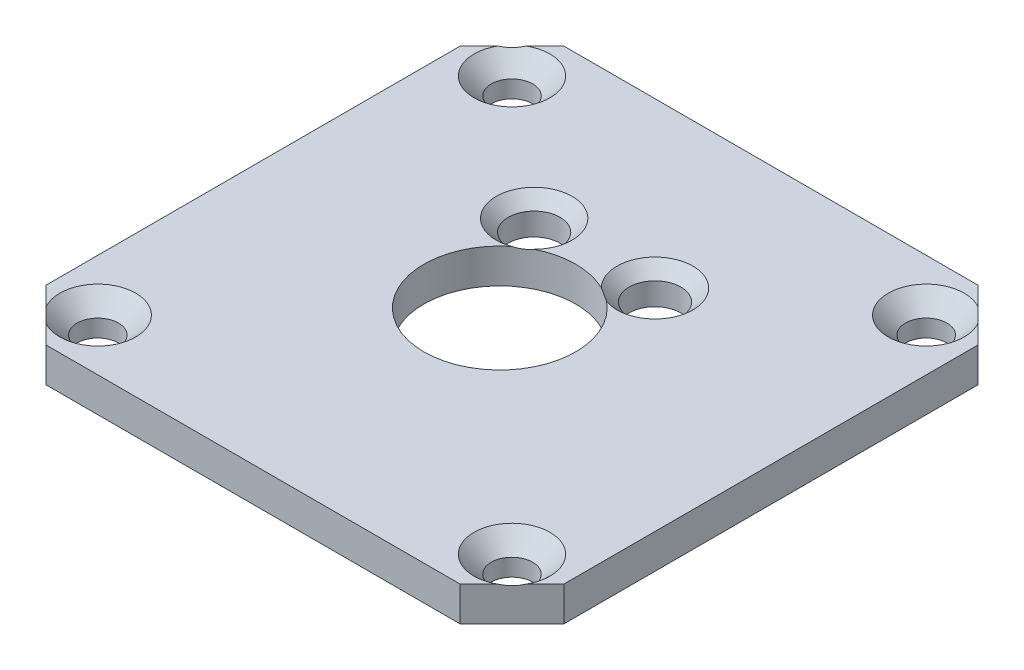
ISO-10303-21;
HEADER;
FILE_DESCRIPTION(('STEP AP214'),'2;1');
FILE_NAME('part.step','',(''),(''),'','','');
FILE_SCHEMA(('AUTOMOTIVE_DESIGN { 1 0 10303 214 1 1 1 1 }'));
ENDSEC;
DATA;
#1=APPLICATION_CONTEXT('core data for automotive mechanical design processes');
#2=APPLICATION_PROTOCOL_DEFINITION('international standard','automotive_design',2000,#1);
#3=PRODUCT_CONTEXT('',#1,'mechanical');
#4=PRODUCT('Part','Part','',(#3));
#5=PRODUCT_RELATED_PRODUCT_CATEGORY('part','',(#4));
#6=PRODUCT_DEFINITION_FORMATION('','',#4);
#7=PRODUCT_DEFINITION_CONTEXT('part definition',#1,'design');
#8=PRODUCT_DEFINITION('design','',#6,#7);
#9=PRODUCT_DEFINITION_SHAPE('','',#8);
#10=(LENGTH_UNIT() NAMED_UNIT(*) SI_UNIT(.MILLI.,.METRE.));
#11=(NAMED_UNIT(*) PLANE_ANGLE_UNIT() SI_UNIT($,.RADIAN.));
#12=(NAMED_UNIT(*) SI_UNIT($,.STERADIAN.) SOLID_ANGLE_UNIT());
#13=UNCERTAINTY_MEASURE_WITH_UNIT(LENGTH_MEASURE(1.E-05),#10,'distance_accuracy_value','');
#14=(GEOMETRIC_REPRESENTATION_CONTEXT(3) GLOBAL_UNCERTAINTY_ASSIGNED_CONTEXT((#13)) GLOBAL_UNIT_ASSIGNED_CONTEXT((#10,
#11,#12)) REPRESENTATION_CONTEXT('',''));
#15=CARTESIAN_POINT('',(0.,0.,0.));
#16=DIRECTION('',(0.,0.,1.));
#17=DIRECTION('',(1.,0.,0.));
#18=AXIS2_PLACEMENT_3D('',#15,#16,#17);
#19=CARTESIAN_POINT('',(-11.2930513451133,2.,-29.7045320216426));
#20=DIRECTION('',(0.707106781186548,0.,0.707106781186547));
#21=DIRECTION('',(0.707106781186547,0.,-0.707106781186548));
#22=AXIS2_PLACEMENT_3D('',#19,#20,#21);
#23=PLANE('',#22);
#24=DIRECTION('',(-0.707106781186547,0.,0.707106781186548));
#25=VECTOR('',#24,1.);
#26=CARTESIAN_POINT('',(-11.2930513451133,2.,-29.7045320216426));
#27=LINE('',#26,#25);
#28=CARTESIAN_POINT('',(-13.2053619076751,2.,-27.7922214590808));
#29=VERTEX_POINT('',#28);
#30=CARTESIAN_POINT('',(-14.2930513451133,2.,-26.7045320216426));
#31=VERTEX_POINT('',#30);
#32=EDGE_CURVE('E151',#29,#31,#27,.T.);
#33=ORIENTED_EDGE('',*,*,#32,.F.);
#34=CARTESIAN_POINT('',(-13.2058951654619,2.0002,-27.791688201294));
#35=CARTESIAN_POINT('',(-13.1683652810428,1.98609883690211,-27.8292180857131));
#36=CARTESIAN_POINT('',(-13.1305013661973,1.97369041932723,-27.8670820005586));
#37=CARTESIAN_POINT('',(-13.0542312881725,1.95259155160978,-27.9433520785834));
#38=CARTESIAN_POINT('',(-13.0158247307933,1.94390396484983,-27.9817586359625));
#39=CARTESIAN_POINT('',(-12.9394068569881,1.93073183650474,-28.0581765097678));
#40=CARTESIAN_POINT('',(-12.9014024694848,1.92616852686854,-28.096180897271));
#41=CARTESIAN_POINT('',(-12.825280871013,1.92112777104609,-28.1723024957429));
#42=CARTESIAN_POINT('',(-12.7871637195052,1.92064845958808,-28.2104196472506));
#43=CARTESIAN_POINT('',(-12.6873114085194,1.92479931647525,-28.3102719582365));
#44=CARTESIAN_POINT('',(-12.6256274542583,1.93279174577352,-28.3719559124976));
#45=CARTESIAN_POINT('',(-12.5334631745855,1.95240964440381,-28.4641201921704));
#46=CARTESIAN_POINT('',(-12.5025512310558,1.96031722904164,-28.4950321357));
#47=CARTESIAN_POINT('',(-12.4410947224758,1.97851917174721,-28.5564886442801));
#48=CARTESIAN_POINT('',(-12.4105499911211,1.98881240299407,-28.5870333756348));
#49=CARTESIAN_POINT('',(-12.3802075247647,2.0002,-28.6173758419911));
#50=B_SPLINE_CURVE_WITH_KNOTS('',3,(#34,#35,#36,#37,#38,#39,#40,#41,#42,#43,#44,#45,#46,#47,#48,
#49),.UNSPECIFIED.,.F.,.F.,(4,2,2,2,2,2,2,4),(0.,0.16475441133125,0.32963538336149,
0.491296391915612,0.652883561581714,0.914941886772895,1.04816441811727,1.18132415177356),.UNSPECIFIED.);
#51=CARTESIAN_POINT('',(-12.3807407825515,2.,-28.6168425842043));
#52=VERTEX_POINT('',#51);
#53=EDGE_CURVE('E59',#29,#52,#50,.T.);
#54=ORIENTED_EDGE('',*,*,#53,.T.);
#55=CARTESIAN_POINT('',(-11.2930513451133,2.,-29.7045320216426));
#56=VERTEX_POINT('',#55);
#57=EDGE_CURVE('E149',#56,#52,#27,.T.);
#58=ORIENTED_EDGE('',*,*,#57,.F.);
#59=DIRECTION('',(0.,-1.,0.));
#60=VECTOR('',#59,1.);
#61=CARTESIAN_POINT('',(-11.2930513451133,2.,-29.7045320216426));
#62=LINE('',#61,#60);
#63=CARTESIAN_POINT('',(-11.2930513451133,0.,-29.7045320216426));
#64=VERTEX_POINT('',#63);
#65=EDGE_CURVE('E193',#56,#64,#62,.T.);
#66=ORIENTED_EDGE('',*,*,#65,.T.);
#67=DIRECTION('',(-0.707106781186547,0.,0.707106781186548));
#68=VECTOR('',#67,1.);
#69=CARTESIAN_POINT('',(-11.2930513451133,0.,-29.7045320216426));
#70=LINE('',#69,#68);
#71=CARTESIAN_POINT('',(-14.2930513451133,0.,-26.7045320216426));
#72=VERTEX_POINT('',#71);
#73=EDGE_CURVE('E194',#64,#72,#70,.T.);
#74=ORIENTED_EDGE('',*,*,#73,.T.);
#75=DIRECTION('',(0.,-1.,0.));
#76=VECTOR('',#75,1.);
#77=CARTESIAN_POINT('',(-14.2930513451133,2.,-26.7045320216426));
#78=LINE('',#77,#76);
#79=EDGE_CURVE('E245',#31,#72,#78,.T.);
#80=ORIENTED_EDGE('',*,*,#79,.F.);
#81=EDGE_LOOP('',(#33,#54,#58,#66,#74,#80));
#82=FACE_BOUND('',#81,.T.);
#83=ADVANCED_FACE('F44',(#82),#23,.F.);
#84=CARTESIAN_POINT('',(-14.2930513451133,2.,-26.7045320216426));
#85=DIRECTION('',(1.,0.,0.));
#86=DIRECTION('',(0.,0.,-1.));
#87=AXIS2_PLACEMENT_3D('',#84,#85,#86);
#88=PLANE('',#87);
#89=DIRECTION('',(0.,0.,1.));
#90=VECTOR('',#89,1.);
#91=CARTESIAN_POINT('',(-14.2930513451133,0.,-26.7045320216426));
#92=LINE('',#91,#90);
#93=CARTESIAN_POINT('',(-14.2930513451133,0.,-2.70453202164257));
#94=VERTEX_POINT('',#93);
#95=EDGE_CURVE('E198',#72,#94,#92,.T.);
#96=ORIENTED_EDGE('',*,*,#95,.T.);
#97=DIRECTION('',(0.,-1.,0.));
#98=VECTOR('',#97,1.);
#99=CARTESIAN_POINT('',(-14.2930513451133,2.,-2.70453202164257));
#100=LINE('',#99,#98);
#101=CARTESIAN_POINT('',(-14.2930513451133,2.,-2.70453202164257));
#102=VERTEX_POINT('',#101);
#103=EDGE_CURVE('E241',#102,#94,#100,.T.);
#104=ORIENTED_EDGE('',*,*,#103,.F.);
#105=DIRECTION('',(0.,0.,1.));
#106=VECTOR('',#105,1.);
#107=CARTESIAN_POINT('',(-14.2930513451133,2.,-26.7045320216426));
#108=LINE('',#107,#106);
#109=EDGE_CURVE('E160',#31,#102,#108,.T.);
#110=ORIENTED_EDGE('',*,*,#109,.F.);
#111=ORIENTED_EDGE('',*,*,#79,.T.);
#112=EDGE_LOOP('',(#96,#104,#110,#111));
#113=FACE_BOUND('',#112,.T.);
#114=ADVANCED_FACE('F292',(#113),#88,.F.);
#115=CARTESIAN_POINT('',(-11.2930513451133,2.,0.295467978357432));
#116=DIRECTION('',(0.707106781186547,0.,-0.707106781186548));
#117=DIRECTION('',(-0.707106781186548,0.,-0.707106781186547));
#118=AXIS2_PLACEMENT_3D('',#115,#116,#117);
#119=PLANE('',#118);
#120=DIRECTION('',(0.707106781186548,0.,0.707106781186547));
#121=VECTOR('',#120,1.);
#122=CARTESIAN_POINT('',(-11.2930513451133,2.,0.295467978357432));
#123=LINE('',#122,#121);
#124=CARTESIAN_POINT('',(-12.3807407825515,2.,-0.792221459080797));
#125=VERTEX_POINT('',#124);
#126=CARTESIAN_POINT('',(-11.2930513451133,2.,0.295467978357432));
#127=VERTEX_POINT('',#126);
#128=EDGE_CURVE('E164',#125,#127,#123,.T.);
#129=ORIENTED_EDGE('',*,*,#128,.F.);
#130=CARTESIAN_POINT('',(-12.3802075247644,2.00020000000014,-0.791688201293631));
#131=CARTESIAN_POINT('',(-12.4177374091835,1.98609883690224,-0.829218085712754));
#132=CARTESIAN_POINT('',(-12.455601324029,1.97369041932734,-0.867082000558214));
#133=CARTESIAN_POINT('',(-12.5318714020538,1.95259155160986,-0.94335207858303));
#134=CARTESIAN_POINT('',(-12.5702779594329,1.9439039648499,-0.981758635962183));
#135=CARTESIAN_POINT('',(-12.6466958332382,1.93073183650479,-1.05817650976747));
#136=CARTESIAN_POINT('',(-12.6847002207414,1.92616852686858,-1.09618089727068));
#137=CARTESIAN_POINT('',(-12.7608218192132,1.9211277710461,-1.1723024957425));
#138=CARTESIAN_POINT('',(-12.798938970721,1.92064845958808,-1.21041964725029));
#139=CARTESIAN_POINT('',(-12.898791281707,1.92479931647522,-1.31027195823627));
#140=CARTESIAN_POINT('',(-12.9604752359682,1.9327917457735,-1.3719559124975));
#141=CARTESIAN_POINT('',(-13.0526395156412,1.95240964440383,-1.46412019217047));
#142=CARTESIAN_POINT('',(-13.0835514591709,1.96031722904168,-1.49503213570017));
#143=CARTESIAN_POINT('',(-13.1450079677511,1.97851917174728,-1.55648864428032));
#144=CARTESIAN_POINT('',(-13.1755526991059,1.98881240299418,-1.58703337563513));
#145=CARTESIAN_POINT('',(-13.2058951654623,2.00020000000014,-1.61737584199151));
#146=B_SPLINE_CURVE_WITH_KNOTS('',3,(#130,#131,#132,#133,#134,#135,#136,#137,#138,#139,#140,
#141,#142,#143,#144,#145),.UNSPECIFIED.,.F.,.F.,(4,2,2,2,2,2,2,4),(0.,0.164754411331261,
0.329635383361513,0.491296391915639,0.652883561581751,0.914941886773442,1.04816441811808,
1.18132415177463),.UNSPECIFIED.);
#147=CARTESIAN_POINT('',(-13.2053619076751,2.,-1.61684258420434));
#148=VERTEX_POINT('',#147);
#149=EDGE_CURVE('E53',#125,#148,#146,.T.);
#150=ORIENTED_EDGE('',*,*,#149,.T.);
#151=EDGE_CURVE('E171',#102,#148,#123,.T.);
#152=ORIENTED_EDGE('',*,*,#151,.F.);
#153=ORIENTED_EDGE('',*,*,#103,.T.);
#154=DIRECTION('',(0.707106781186548,0.,0.707106781186547));
#155=VECTOR('',#154,1.);
#156=CARTESIAN_POINT('',(-11.2930513451133,0.,0.295467978357432));
#157=LINE('',#156,#155);
#158=CARTESIAN_POINT('',(-11.2930513451133,0.,0.295467978357432));
#159=VERTEX_POINT('',#158);
#160=EDGE_CURVE('E202',#94,#159,#157,.T.);
#161=ORIENTED_EDGE('',*,*,#160,.T.);
#162=DIRECTION('',(0.,-1.,0.));
#163=VECTOR('',#162,1.);
#164=CARTESIAN_POINT('',(-11.2930513451133,2.,0.295467978357432));
#165=LINE('',#164,#163);
#166=EDGE_CURVE('E237',#127,#159,#165,.T.);
#167=ORIENTED_EDGE('',*,*,#166,.F.);
#168=EDGE_LOOP('',(#129,#150,#152,#153,#161,#167));
#169=FACE_BOUND('',#168,.T.);
#170=ADVANCED_FACE('F298',(#169),#119,.F.);
#171=CARTESIAN_POINT('',(12.7069486548867,2.,0.29546797835743));
#172=DIRECTION('',(0.,0.,-1.));
#173=DIRECTION('',(-1.,0.,0.));
#174=AXIS2_PLACEMENT_3D('',#171,#172,#173);
#175=PLANE('',#174);
#176=DIRECTION('',(1.,0.,0.));
#177=VECTOR('',#176,1.);
#178=CARTESIAN_POINT('',(12.7069486548867,0.,0.29546797835743));
#179=LINE('',#178,#177);
#180=CARTESIAN_POINT('',(12.7069486548867,0.,0.29546797835743));
#181=VERTEX_POINT('',#180);
#182=EDGE_CURVE('E205',#159,#181,#179,.T.);
#183=ORIENTED_EDGE('',*,*,#182,.T.);
#184=DIRECTION('',(0.,-1.,0.));
#185=VECTOR('',#184,1.);
#186=CARTESIAN_POINT('',(12.7069486548867,2.,0.29546797835743));
#187=LINE('',#186,#185);
#188=CARTESIAN_POINT('',(12.7069486548867,2.,0.29546797835743));
#189=VERTEX_POINT('',#188);
#190=EDGE_CURVE('E233',#189,#181,#187,.T.);
#191=ORIENTED_EDGE('',*,*,#190,.F.);
#192=DIRECTION('',(1.,0.,0.));
#193=VECTOR('',#192,1.);
#194=CARTESIAN_POINT('',(12.7069486548867,2.,0.29546797835743));
#195=LINE('',#194,#193);
#196=EDGE_CURVE('E175',#127,#189,#195,.T.);
#197=ORIENTED_EDGE('',*,*,#196,.F.);
#198=ORIENTED_EDGE('',*,*,#166,.T.);
#199=EDGE_LOOP('',(#183,#191,#197,#198));
#200=FACE_BOUND('',#199,.T.);
#201=ADVANCED_FACE('F303',(#200),#175,.F.);
#202=CARTESIAN_POINT('',(15.7069486548867,2.,-2.70453202164257));
#203=DIRECTION('',(-0.707106781186547,0.,-0.707106781186548));
#204=DIRECTION('',(-0.707106781186548,0.,0.707106781186547));
#205=AXIS2_PLACEMENT_3D('',#202,#203,#204);
#206=PLANE('',#205);
#207=DIRECTION('',(0.707106781186548,0.,-0.707106781186547));
#208=VECTOR('',#207,1.);
#209=CARTESIAN_POINT('',(15.7069486548867,2.,-2.70453202164257));
#210=LINE('',#209,#208);
#211=CARTESIAN_POINT('',(14.6192592174485,2.,-1.61684258420435));
#212=VERTEX_POINT('',#211);
#213=CARTESIAN_POINT('',(15.7069486548867,2.,-2.70453202164257));
#214=VERTEX_POINT('',#213);
#215=EDGE_CURVE('E178',#212,#214,#210,.T.);
#216=ORIENTED_EDGE('',*,*,#215,.F.);
#217=CARTESIAN_POINT('',(14.6197924752356,2.00020000000014,-1.61737584199152));
#218=CARTESIAN_POINT('',(14.5822625908165,1.98609883690224,-1.57984595757239));
#219=CARTESIAN_POINT('',(14.544398675971,1.97369041932734,-1.54198204272693));
#220=CARTESIAN_POINT('',(14.4681285979462,1.95259155160986,-1.46571196470212));
#221=CARTESIAN_POINT('',(14.4297220405671,1.9439039648499,-1.42730540732297));
#222=CARTESIAN_POINT('',(14.3533041667618,1.93073183650479,-1.35088753351768));
#223=CARTESIAN_POINT('',(14.3152997792586,1.92616852686858,-1.31288314601446));
#224=CARTESIAN_POINT('',(14.2391781807868,1.92112777104609,-1.23676154754264));
#225=CARTESIAN_POINT('',(14.201061029279,1.92064845958808,-1.19864439603486));
#226=CARTESIAN_POINT('',(14.101208718293,1.92479931647522,-1.09879208504888));
#227=CARTESIAN_POINT('',(14.0395247640318,1.93279174577349,-1.03710813078764));
#228=CARTESIAN_POINT('',(13.9473604843588,1.95240964440382,-0.944943851114672));
#229=CARTESIAN_POINT('',(13.9164485408291,1.96031722904167,-0.914031907584965));
#230=CARTESIAN_POINT('',(13.8549920322489,1.97851917174728,-0.852575399004808));
#231=CARTESIAN_POINT('',(13.8244473008941,1.98881240299418,-0.822030667649998));
#232=CARTESIAN_POINT('',(13.7941048345377,2.00020000000014,-0.791688201293624));
#233=B_SPLINE_CURVE_WITH_KNOTS('',3,(#217,#218,#219,#220,#221,#222,#223,#224,#225,#226,#227,
#228,#229,#230,#231,#232),.UNSPECIFIED.,.F.,.F.,(4,2,2,2,2,2,2,4),(0.,0.164754411331263,
0.329635383361515,0.49129639191564,0.652883561581751,0.914941886773454,1.0481644181181,
1.18132415177466),.UNSPECIFIED.);
#234=CARTESIAN_POINT('',(13.7946380923249,2.,-0.792221459080793));
#235=VERTEX_POINT('',#234);
#236=EDGE_CURVE('E372',#212,#235,#233,.T.);
#237=ORIENTED_EDGE('',*,*,#236,.T.);
#238=EDGE_CURVE('E179',#189,#235,#210,.T.);
#239=ORIENTED_EDGE('',*,*,#238,.F.);
#240=ORIENTED_EDGE('',*,*,#190,.T.);
#241=DIRECTION('',(0.707106781186548,0.,-0.707106781186547));
#242=VECTOR('',#241,1.);
#243=CARTESIAN_POINT('',(15.7069486548867,0.,-2.70453202164257));
#244=LINE('',#243,#242);
#245=CARTESIAN_POINT('',(15.7069486548867,0.,-2.70453202164257));
#246=VERTEX_POINT('',#245);
#247=EDGE_CURVE('E208',#181,#246,#244,.T.);
#248=ORIENTED_EDGE('',*,*,#247,.T.);
#249=DIRECTION('',(0.,-1.,0.));
#250=VECTOR('',#249,1.);
#251=CARTESIAN_POINT('',(15.7069486548867,2.,-2.70453202164257));
#252=LINE('',#251,#250);
#253=EDGE_CURVE('E229',#214,#246,#252,.T.);
#254=ORIENTED_EDGE('',*,*,#253,.F.);
#255=EDGE_LOOP('',(#216,#237,#239,#240,#248,#254));
#256=FACE_BOUND('',#255,.T.);
#257=ADVANCED_FACE('F367',(#256),#206,.F.);
#258=CARTESIAN_POINT('',(15.7069486548867,2.,-26.7045320216426));
#259=DIRECTION('',(-1.,0.,0.));
#260=DIRECTION('',(0.,0.,1.));
#261=AXIS2_PLACEMENT_3D('',#258,#259,#260);
#262=PLANE('',#261);
#263=DIRECTION('',(0.,0.,-1.));
#264=VECTOR('',#263,1.);
#265=CARTESIAN_POINT('',(15.7069486548867,0.,-26.7045320216426));
#266=LINE('',#265,#264);
#267=CARTESIAN_POINT('',(15.7069486548867,0.,-26.7045320216426));
#268=VERTEX_POINT('',#267);
#269=EDGE_CURVE('E211',#246,#268,#266,.T.);
#270=ORIENTED_EDGE('',*,*,#269,.T.);
#271=DIRECTION('',(0.,-1.,0.));
#272=VECTOR('',#271,1.);
#273=CARTESIAN_POINT('',(15.7069486548867,2.,-26.7045320216426));
#274=LINE('',#273,#272);
#275=CARTESIAN_POINT('',(15.7069486548867,2.,-26.7045320216426));
#276=VERTEX_POINT('',#275);
#277=EDGE_CURVE('E225',#276,#268,#274,.T.);
#278=ORIENTED_EDGE('',*,*,#277,.F.);
#279=DIRECTION('',(0.,0.,-1.));
#280=VECTOR('',#279,1.);
#281=CARTESIAN_POINT('',(15.7069486548867,2.,-26.7045320216426));
#282=LINE('',#281,#280);
#283=EDGE_CURVE('E183',#214,#276,#282,.T.);
#284=ORIENTED_EDGE('',*,*,#283,.F.);
#285=ORIENTED_EDGE('',*,*,#253,.T.);
#286=EDGE_LOOP('',(#270,#278,#284,#285));
#287=FACE_BOUND('',#286,.T.);
#288=ADVANCED_FACE('F363',(#287),#262,.F.);
#289=CARTESIAN_POINT('',(12.7069486548867,2.,-29.7045320216426));
#290=DIRECTION('',(-0.707106781186548,0.,0.707106781186547));
#291=DIRECTION('',(0.707106781186547,0.,0.707106781186548));
#292=AXIS2_PLACEMENT_3D('',#289,#290,#291);
#293=PLANE('',#292);
#294=DIRECTION('',(-0.707106781186547,0.,-0.707106781186548));
#295=VECTOR('',#294,1.);
#296=CARTESIAN_POINT('',(12.7069486548867,2.,-29.7045320216426));
#297=LINE('',#296,#295);
#298=CARTESIAN_POINT('',(13.7946380923249,2.,-28.6168425842043));
#299=VERTEX_POINT('',#298);
#300=CARTESIAN_POINT('',(12.7069486548867,2.,-29.7045320216426));
#301=VERTEX_POINT('',#300);
#302=EDGE_CURVE('E186',#299,#301,#297,.T.);
#303=ORIENTED_EDGE('',*,*,#302,.F.);
#304=CARTESIAN_POINT('',(13.7941048345377,2.00020000000014,-28.6173758419915));
#305=CARTESIAN_POINT('',(13.8316347189569,1.98609883690224,-28.5798459575724));
#306=CARTESIAN_POINT('',(13.8694986338023,1.97369041932734,-28.5419820427269));
#307=CARTESIAN_POINT('',(13.9457687118271,1.95259155160986,-28.4657119647021));
#308=CARTESIAN_POINT('',(13.9841752692063,1.9439039648499,-28.427305407323));
#309=CARTESIAN_POINT('',(14.0605931430116,1.93073183650479,-28.3508875335177));
#310=CARTESIAN_POINT('',(14.0985975305148,1.92616852686858,-28.3128831460144));
#311=CARTESIAN_POINT('',(14.1747191289866,1.9211277710461,-28.2367615475426));
#312=CARTESIAN_POINT('',(14.2128362804944,1.92064845958808,-28.1986443960348));
#313=CARTESIAN_POINT('',(14.3126885914804,1.92479931647522,-28.0987920850489));
#314=CARTESIAN_POINT('',(14.3743725457416,1.9327917457735,-28.0371081307876));
#315=CARTESIAN_POINT('',(14.4665368254146,1.95240964440383,-27.9449438511147));
#316=CARTESIAN_POINT('',(14.4974487689443,1.96031722904168,-27.914031907585));
#317=CARTESIAN_POINT('',(14.5589052775244,1.97851917174729,-27.8525753990048));
#318=CARTESIAN_POINT('',(14.5894500088793,1.98881240299418,-27.82203066765));
#319=CARTESIAN_POINT('',(14.6197924752356,2.00020000000014,-27.7916882012936));
#320=B_SPLINE_CURVE_WITH_KNOTS('',3,(#304,#305,#306,#307,#308,#309,#310,#311,#312,#313,#314,
#315,#316,#317,#318,#319),.UNSPECIFIED.,.F.,.F.,(4,2,2,2,2,2,2,4),(0.,0.164754411331258,
0.329635383361513,0.491296391915641,0.652883561581751,0.914941886773441,1.04816441811808,
1.18132415177463),.UNSPECIFIED.);
#321=CARTESIAN_POINT('',(14.6192592174485,2.,-27.7922214590808));
#322=VERTEX_POINT('',#321);
#323=EDGE_CURVE('E342',#299,#322,#320,.T.);
#324=ORIENTED_EDGE('',*,*,#323,.T.);
#325=EDGE_CURVE('E187',#276,#322,#297,.T.);
#326=ORIENTED_EDGE('',*,*,#325,.F.);
#327=ORIENTED_EDGE('',*,*,#277,.T.);
#328=DIRECTION('',(-0.707106781186547,0.,-0.707106781186548));
#329=VECTOR('',#328,1.);
#330=CARTESIAN_POINT('',(12.7069486548867,0.,-29.7045320216426));
#331=LINE('',#330,#329);
#332=CARTESIAN_POINT('',(12.7069486548867,0.,-29.7045320216426));
#333=VERTEX_POINT('',#332);
#334=EDGE_CURVE('E214',#268,#333,#331,.T.);
#335=ORIENTED_EDGE('',*,*,#334,.T.);
#336=DIRECTION('',(0.,-1.,0.));
#337=VECTOR('',#336,1.);
#338=CARTESIAN_POINT('',(12.7069486548867,2.,-29.7045320216426));
#339=LINE('',#338,#337);
#340=EDGE_CURVE('E221',#301,#333,#339,.T.);
#341=ORIENTED_EDGE('',*,*,#340,.F.);
#342=EDGE_LOOP('',(#303,#324,#326,#327,#335,#341));
#343=FACE_BOUND('',#342,.T.);
#344=ADVANCED_FACE('F357',(#343),#293,.F.);
#345=CARTESIAN_POINT('',(-11.2930513451133,2.,-29.7045320216426));
#346=DIRECTION('',(0.,0.,1.));
#347=DIRECTION('',(1.,0.,0.));
#348=AXIS2_PLACEMENT_3D('',#345,#346,#347);
#349=PLANE('',#348);
#350=DIRECTION('',(-1.,0.,0.));
#351=VECTOR('',#350,1.);
#352=CARTESIAN_POINT('',(-11.2930513451133,0.,-29.7045320216426));
#353=LINE('',#352,#351);
#354=EDGE_CURVE('E166',#333,#64,#353,.T.);
#355=ORIENTED_EDGE('',*,*,#354,.T.);
#356=ORIENTED_EDGE('',*,*,#65,.F.);
#357=DIRECTION('',(-1.,0.,0.));
#358=VECTOR('',#357,1.);
#359=CARTESIAN_POINT('',(-11.2930513451133,2.,-29.7045320216426));
#360=LINE('',#359,#358);
#361=EDGE_CURVE('E157',#301,#56,#360,.T.);
#362=ORIENTED_EDGE('',*,*,#361,.F.);
#363=ORIENTED_EDGE('',*,*,#340,.T.);
#364=EDGE_LOOP('',(#355,#356,#362,#363));
#365=FACE_BOUND('',#364,.T.);
#366=ADVANCED_FACE('F362',(#365),#349,.F.);
#367=CARTESIAN_POINT('',(0.,2.,0.));
#368=DIRECTION('',(0.,-1.,0.));
#369=DIRECTION('',(0.,0.,-1.));
#370=AXIS2_PLACEMENT_3D('',#367,#368,#369);
#371=PLANE('',#370);
#372=CARTESIAN_POINT('',(0.,2.,-14.7045320216426));
#373=DIRECTION('',(0.,1.,0.));
#374=DIRECTION('',(0.,0.,1.));
#375=AXIS2_PLACEMENT_3D('',#372,#373,#374);
#376=CIRCLE('',#375,4.4);
#377=CARTESIAN_POINT('',(-2.74972363666003,2.,-18.1395021702746));
#378=VERTEX_POINT('',#377);
#379=CARTESIAN_POINT('',(2.76335452315258,2.,-18.1285460080877));
#380=VERTEX_POINT('',#379);
#381=EDGE_CURVE('E417',#378,#380,#376,.T.);
#382=ORIENTED_EDGE('',*,*,#381,.F.);
#383=CARTESIAN_POINT('',(-3.50844078617074,2.,-20.204532021642));
#384=DIRECTION('',(0.,1.,0.));
#385=DIRECTION('',(0.,0.,1.));
#386=AXIS2_PLACEMENT_3D('',#383,#384,#385);
#387=CIRCLE('',#386,2.2);
#388=CARTESIAN_POINT('',(-1.95569951723884,2.,-18.6460088258711));
#389=VERTEX_POINT('',#388);
#390=EDGE_CURVE('E398',#389,#378,#387,.T.);
#391=ORIENTED_EDGE('',*,*,#390,.F.);
#392=CARTESIAN_POINT('',(1.92274432957956,2.,-18.6621896929261));
#393=VERTEX_POINT('',#392);
#394=EDGE_CURVE('E168',#393,#389,#376,.T.);
#395=ORIENTED_EDGE('',*,*,#394,.F.);
#396=CARTESIAN_POINT('',(3.49155921383182,2.,-20.204532021642));
#397=DIRECTION('',(0.,1.,0.));
#398=DIRECTION('',(0.,0.,1.));
#399=AXIS2_PLACEMENT_3D('',#396,#397,#398);
#400=CIRCLE('',#399,2.2);
#401=EDGE_CURVE('E406',#380,#393,#400,.T.);
#402=ORIENTED_EDGE('',*,*,#401,.F.);
#403=EDGE_LOOP('',(#382,#391,#395,#402));
#404=FACE_BOUND('',#403,.T.);
#405=ORIENTED_EDGE('',*,*,#57,.T.);
#406=CARTESIAN_POINT('',(-11.2930513451133,2.,-26.7045320216426));
#407=DIRECTION('',(0.,-1.,0.));
#408=DIRECTION('',(0.,0.,-1.));
#409=AXIS2_PLACEMENT_3D('',#406,#407,#408);
#410=CIRCLE('',#409,2.2);
#411=EDGE_CURVE('E11',#52,#29,#410,.T.);
#412=ORIENTED_EDGE('',*,*,#411,.T.);
#413=ORIENTED_EDGE('',*,*,#32,.T.);
#414=ORIENTED_EDGE('',*,*,#109,.T.);
#415=ORIENTED_EDGE('',*,*,#151,.T.);
#416=CARTESIAN_POINT('',(-11.2930513451133,2.,-2.70453202164257));
#417=DIRECTION('',(0.,1.,0.));
#418=DIRECTION('',(0.,0.,1.));
#419=AXIS2_PLACEMENT_3D('',#416,#417,#418);
#420=CIRCLE('',#419,2.2);
#421=EDGE_CURVE('E65',#125,#148,#420,.T.);
#422=ORIENTED_EDGE('',*,*,#421,.F.);
#423=ORIENTED_EDGE('',*,*,#128,.T.);
#424=ORIENTED_EDGE('',*,*,#196,.T.);
#425=ORIENTED_EDGE('',*,*,#238,.T.);
#426=CARTESIAN_POINT('',(12.7069486548867,2.,-2.70453202164257));
#427=DIRECTION('',(0.,1.,0.));
#428=DIRECTION('',(0.,0.,1.));
#429=AXIS2_PLACEMENT_3D('',#426,#427,#428);
#430=CIRCLE('',#429,2.2);
#431=EDGE_CURVE('E352',#212,#235,#430,.T.);
#432=ORIENTED_EDGE('',*,*,#431,.F.);
#433=ORIENTED_EDGE('',*,*,#215,.T.);
#434=ORIENTED_EDGE('',*,*,#283,.T.);
#435=ORIENTED_EDGE('',*,*,#325,.T.);
#436=CARTESIAN_POINT('',(12.7069486548867,2.,-26.7045320216426));
#437=DIRECTION('',(0.,-1.,0.));
#438=DIRECTION('',(0.,0.,-1.));
#439=AXIS2_PLACEMENT_3D('',#436,#437,#438);
#440=CIRCLE('',#439,2.2);
#441=EDGE_CURVE('E318',#322,#299,#440,.T.);
#442=ORIENTED_EDGE('',*,*,#441,.T.);
#443=ORIENTED_EDGE('',*,*,#302,.T.);
#444=ORIENTED_EDGE('',*,*,#361,.T.);
#445=EDGE_LOOP('',(#405,#412,#413,#414,#415,#422,#423,#424,#425,#432,#433,#434,#435,#442,#443,#444));
#446=FACE_BOUND('',#445,.T.);
#447=ADVANCED_FACE('F155',(#404,#446),#371,.F.);
#448=CARTESIAN_POINT('',(0.,0.,0.));
#449=DIRECTION('',(0.,-1.,0.));
#450=DIRECTION('',(0.,0.,-1.));
#451=AXIS2_PLACEMENT_3D('',#448,#449,#450);
#452=PLANE('',#451);
#453=CARTESIAN_POINT('',(-11.2930513451133,0.,-26.7045320216426));
#454=DIRECTION('',(0.,-1.,0.));
#455=DIRECTION('',(0.,0.,-1.));
#456=AXIS2_PLACEMENT_3D('',#453,#454,#455);
#457=CIRCLE('',#456,1.19999999999999);
#458=CARTESIAN_POINT('',(-11.2930513451133,0.,-27.9045320216426));
#459=VERTEX_POINT('',#458);
#460=EDGE_CURVE('E153',#459,#459,#457,.T.);
#461=ORIENTED_EDGE('',*,*,#460,.F.);
#462=EDGE_LOOP('',(#461));
#463=FACE_BOUND('',#462,.T.);
#464=CARTESIAN_POINT('',(-11.2930513451133,0.,-2.70453202164257));
#465=DIRECTION('',(0.,-1.,0.));
#466=DIRECTION('',(0.,0.,-1.));
#467=AXIS2_PLACEMENT_3D('',#464,#465,#466);
#468=CIRCLE('',#467,1.19999999999999);
#469=CARTESIAN_POINT('',(-11.2930513451133,0.,-3.90453202164256));
#470=VERTEX_POINT('',#469);
#471=EDGE_CURVE('E320',#470,#470,#468,.T.);
#472=ORIENTED_EDGE('',*,*,#471,.F.);
#473=EDGE_LOOP('',(#472));
#474=FACE_BOUND('',#473,.T.);
#475=CARTESIAN_POINT('',(12.7069486548867,0.,-26.7045320216426));
#476=DIRECTION('',(0.,-1.,0.));
#477=DIRECTION('',(0.,0.,-1.));
#478=AXIS2_PLACEMENT_3D('',#475,#476,#477);
#479=CIRCLE('',#478,1.19999999999999);
#480=CARTESIAN_POINT('',(12.7069486548867,0.,-27.9045320216426));
#481=VERTEX_POINT('',#480);
#482=EDGE_CURVE('E353',#481,#481,#479,.T.);
#483=ORIENTED_EDGE('',*,*,#482,.F.);
#484=EDGE_LOOP('',(#483));
#485=FACE_BOUND('',#484,.T.);
#486=CARTESIAN_POINT('',(12.7069486548867,0.,-2.70453202164257));
#487=DIRECTION('',(0.,-1.,0.));
#488=DIRECTION('',(0.,0.,-1.));
#489=AXIS2_PLACEMENT_3D('',#486,#487,#488);
#490=CIRCLE('',#489,1.19999999999999);
#491=CARTESIAN_POINT('',(12.7069486548867,0.,-3.90453202164255));
#492=VERTEX_POINT('',#491);
#493=EDGE_CURVE('E380',#492,#492,#490,.T.);
#494=ORIENTED_EDGE('',*,*,#493,.F.);
#495=EDGE_LOOP('',(#494));
#496=FACE_BOUND('',#495,.T.);
#497=CARTESIAN_POINT('',(-3.50844078617074,0.,-20.204532021642));
#498=DIRECTION('',(0.,-1.,0.));
#499=DIRECTION('',(0.,0.,-1.));
#500=AXIS2_PLACEMENT_3D('',#497,#498,#499);
#501=CIRCLE('',#500,1.49999999999995);
#502=CARTESIAN_POINT('',(-3.50844078617074,0.,-21.7045320216419));
#503=VERTEX_POINT('',#502);
#504=EDGE_CURVE('E413',#503,#503,#501,.F.);
#505=ORIENTED_EDGE('',*,*,#504,.T.);
#506=EDGE_LOOP('',(#505));
#507=FACE_BOUND('',#506,.T.);
#508=CARTESIAN_POINT('',(3.49155921383182,0.,-20.204532021642));
#509=DIRECTION('',(0.,-1.,0.));
#510=DIRECTION('',(0.,0.,-1.));
#511=AXIS2_PLACEMENT_3D('',#508,#509,#510);
#512=CIRCLE('',#511,1.49999999999994);
#513=CARTESIAN_POINT('',(3.49155921383182,0.,-21.7045320216419));
#514=VERTEX_POINT('',#513);
#515=EDGE_CURVE('E412',#514,#514,#512,.F.);
#516=ORIENTED_EDGE('',*,*,#515,.T.);
#517=EDGE_LOOP('',(#516));
#518=FACE_BOUND('',#517,.T.);
#519=CARTESIAN_POINT('',(0.,0.,-14.7045320216426));
#520=DIRECTION('',(0.,1.,0.));
#521=DIRECTION('',(0.,0.,1.));
#522=AXIS2_PLACEMENT_3D('',#519,#520,#521);
#523=CIRCLE('',#522,4.4);
#524=CARTESIAN_POINT('',(0.,0.,-10.3045320216426));
#525=VERTEX_POINT('',#524);
#526=EDGE_CURVE('E199',#525,#525,#523,.T.);
#527=ORIENTED_EDGE('',*,*,#526,.T.);
#528=EDGE_LOOP('',(#527));
#529=FACE_BOUND('',#528,.T.);
#530=ORIENTED_EDGE('',*,*,#73,.F.);
#531=ORIENTED_EDGE('',*,*,#354,.F.);
#532=ORIENTED_EDGE('',*,*,#334,.F.);
#533=ORIENTED_EDGE('',*,*,#269,.F.);
#534=ORIENTED_EDGE('',*,*,#247,.F.);
#535=ORIENTED_EDGE('',*,*,#182,.F.);
#536=ORIENTED_EDGE('',*,*,#160,.F.);
#537=ORIENTED_EDGE('',*,*,#95,.F.);
#538=EDGE_LOOP('',(#530,#531,#532,#533,#534,#535,#536,#537));
#539=FACE_BOUND('',#538,.T.);
#540=ADVANCED_FACE('F287',(#463,#474,#485,#496,#507,#518,#529,#539),#452,.T.);
#541=CARTESIAN_POINT('',(0.,0.,-14.7045320216426));
#542=DIRECTION('',(0.,1.,0.));
#543=DIRECTION('',(0.,0.,1.));
#544=AXIS2_PLACEMENT_3D('',#541,#542,#543);
#545=CYLINDRICAL_SURFACE('',#544,4.4);
#546=ORIENTED_EDGE('',*,*,#526,.F.);
#547=EDGE_LOOP('',(#546));
#548=FACE_BOUND('',#547,.T.);
#549=ORIENTED_EDGE('',*,*,#394,.T.);
#550=CARTESIAN_POINT('',(-1.95513532885718,2.0002,-18.6462887170583));
#551=CARTESIAN_POINT('',(-1.99036367024263,1.98769174365815,-18.6288190123698));
#552=CARTESIAN_POINT('',(-2.02575676467249,1.97651411188079,-18.610671761674));
#553=CARTESIAN_POINT('',(-2.09670373385091,1.95713322505606,-18.5730510796977));
#554=CARTESIAN_POINT('',(-2.13225774717745,1.94893342381911,-18.5535761393918));
#555=CARTESIAN_POINT('',(-2.20226941514207,1.93603705926051,-18.5139391536644));
#556=CARTESIAN_POINT('',(-2.23672959389621,1.93124782872557,-18.4938122052166));
#557=CARTESIAN_POINT('',(-2.30528845977369,1.92499665626662,-18.4524974889537));
#558=CARTESIAN_POINT('',(-2.33938735735061,1.9235326576897,-18.4313103851369));
#559=CARTESIAN_POINT('',(-2.40586194862723,1.92398222659304,-18.3887327262198));
#560=CARTESIAN_POINT('',(-2.43825742554623,1.92578624922969,-18.3673718014841));
#561=CARTESIAN_POINT('',(-2.50226903710252,1.93248789036105,-18.3239445220311));
#562=CARTESIAN_POINT('',(-2.53388473457787,1.93738720494717,-18.3018777868566));
#563=CARTESIAN_POINT('',(-2.59701086895466,1.95027733366012,-18.2565856313698));
#564=CARTESIAN_POINT('',(-2.62849318350447,1.95835144973526,-18.2333450850306));
#565=CARTESIAN_POINT('',(-2.69026675752328,1.97727213521405,-18.1864815901068));
#566=CARTESIAN_POINT('',(-2.72055926788009,1.98811569779713,-18.1628590821134));
#567=CARTESIAN_POINT('',(-2.7502152773583,2.0002,-18.1391085498604));
#568=B_SPLINE_CURVE_WITH_KNOTS('',3,(#550,#551,#552,#553,#554,#555,#556,#557,#558,#559,#560,
#561,#562,#563,#564,#565,#566,#567),.UNSPECIFIED.,.F.,.F.,(4,2,2,2,2,2,2,2,4),(0.,
0.123800393005804,0.247743919643476,0.368176062841214,0.488533698561852,0.604931290504618,
0.721392718877573,0.84113909558613,0.960756010862803),.UNSPECIFIED.);
#569=EDGE_CURVE('E259',#389,#378,#568,.T.);
#570=ORIENTED_EDGE('',*,*,#569,.T.);
#571=ORIENTED_EDGE('',*,*,#381,.T.);
#572=CARTESIAN_POINT('',(2.76381875858426,2.0002,-18.1281712943607));
#573=CARTESIAN_POINT('',(2.7331619806796,1.98697195768394,-18.1529236866027));
#574=CARTESIAN_POINT('',(2.70180716490292,1.97504858767252,-18.1775516018152));
#575=CARTESIAN_POINT('',(2.63777962201376,1.954144784792,-18.2264258028693));
#576=CARTESIAN_POINT('',(2.60510522561084,1.94516821953317,-18.2506715477272));
#577=CARTESIAN_POINT('',(2.53959710601559,1.93074807519181,-18.2978630218125));
#578=CARTESIAN_POINT('',(2.50679769873114,1.92520640320476,-18.3208259208307));
#579=CARTESIAN_POINT('',(2.44033158835366,1.91746497316329,-18.3660064492291));
#580=CARTESIAN_POINT('',(2.40666545969341,1.91526305681488,-18.388224550842));
#581=CARTESIAN_POINT('',(2.33636267859769,1.91425962285461,-18.4332406991351));
#582=CARTESIAN_POINT('',(2.29968072537172,1.91570183728108,-18.4559739041625));
#583=CARTESIAN_POINT('',(2.2258993870635,1.92243774484029,-18.5002170526654));
#584=CARTESIAN_POINT('',(2.18879968931518,1.92773454182139,-18.5217259952623));
#585=CARTESIAN_POINT('',(2.11329985120115,1.94217046484272,-18.5640522823643));
#586=CARTESIAN_POINT('',(2.07489730701214,1.95143095070107,-18.5848231804951));
#587=CARTESIAN_POINT('',(1.99832726884139,1.97336446773307,-18.6248076075022));
#588=CARTESIAN_POINT('',(1.96015951201638,1.98603245389938,-18.6440233845487));
#589=CARTESIAN_POINT('',(1.92220769451533,2.00020000000003,-18.662450360763));
#590=B_SPLINE_CURVE_WITH_KNOTS('',3,(#572,#573,#574,#575,#576,#577,#578,#579,#580,#581,#582,
#583,#584,#585,#586,#587,#588,#589),.UNSPECIFIED.,.F.,.F.,(4,2,2,2,2,2,2,2,4),(0.,
0.124702046664115,0.249567113425624,0.370678627957695,0.491711841613627,0.62105128614274,
0.750494994844546,0.884222621159847,1.01775333528518),.UNSPECIFIED.);
#591=EDGE_CURVE('E249',#380,#393,#590,.T.);
#592=ORIENTED_EDGE('',*,*,#591,.T.);
#593=EDGE_LOOP('',(#549,#570,#571,#592));
#594=FACE_BOUND('',#593,.T.);
#595=ADVANCED_FACE('F266',(#548,#594),#545,.F.);
#596=CARTESIAN_POINT('',(3.49155921383182,-0.00100000000000013,-20.204532021642));
#597=DIRECTION('',(0.,1.,0.));
#598=DIRECTION('',(0.,0.,1.));
#599=AXIS2_PLACEMENT_3D('',#596,#597,#598);
#600=CYLINDRICAL_SURFACE('',#599,1.49999999999994);
#601=CARTESIAN_POINT('',(3.49155921383182,1.29999999999995,-20.204532021642));
#602=DIRECTION('',(0.,1.,0.));
#603=DIRECTION('',(0.,0.,1.));
#604=AXIS2_PLACEMENT_3D('',#601,#602,#603);
#605=CIRCLE('',#604,1.49999999999994);
#606=CARTESIAN_POINT('',(3.49155921383182,1.29999999999995,-18.704532021642));
#607=VERTEX_POINT('',#606);
#608=EDGE_CURVE('E409',#607,#607,#605,.T.);
#609=ORIENTED_EDGE('',*,*,#608,.T.);
#610=EDGE_LOOP('',(#609));
#611=FACE_BOUND('',#610,.T.);
#612=ORIENTED_EDGE('',*,*,#515,.F.);
#613=EDGE_LOOP('',(#612));
#614=FACE_BOUND('',#613,.T.);
#615=ADVANCED_FACE('F280',(#611,#614),#600,.F.);
#616=CARTESIAN_POINT('',(-3.50844078617074,-0.00100000000000013,-20.204532021642));
#617=DIRECTION('',(0.,1.,0.));
#618=DIRECTION('',(0.,0.,1.));
#619=AXIS2_PLACEMENT_3D('',#616,#617,#618);
#620=CYLINDRICAL_SURFACE('',#619,1.49999999999995);
#621=CARTESIAN_POINT('',(-3.50844078617074,1.29999999999995,-20.204532021642));
#622=DIRECTION('',(0.,1.,0.));
#623=DIRECTION('',(0.,0.,1.));
#624=AXIS2_PLACEMENT_3D('',#621,#622,#623);
#625=CIRCLE('',#624,1.49999999999995);
#626=CARTESIAN_POINT('',(-3.50844078617074,1.29999999999995,-18.704532021642));
#627=VERTEX_POINT('',#626);
#628=EDGE_CURVE('E402',#627,#627,#625,.T.);
#629=ORIENTED_EDGE('',*,*,#628,.T.);
#630=EDGE_LOOP('',(#629));
#631=FACE_BOUND('',#630,.T.);
#632=ORIENTED_EDGE('',*,*,#504,.F.);
#633=EDGE_LOOP('',(#632));
#634=FACE_BOUND('',#633,.T.);
#635=ADVANCED_FACE('F275',(#631,#634),#620,.F.);
#636=CARTESIAN_POINT('',(3.49155921383182,2.,-20.204532021642));
#637=DIRECTION('',(0.,1.,0.));
#638=DIRECTION('',(0.,0.,1.));
#639=AXIS2_PLACEMENT_3D('',#636,#637,#638);
#640=CONICAL_SURFACE('',#639,2.2,0.785398163397451);
#641=ORIENTED_EDGE('',*,*,#401,.T.);
#642=ORIENTED_EDGE('',*,*,#591,.F.);
#643=EDGE_LOOP('',(#641,#642));
#644=FACE_BOUND('',#643,.T.);
#645=ORIENTED_EDGE('',*,*,#608,.F.);
#646=EDGE_LOOP('',(#645));
#647=FACE_BOUND('',#646,.T.);
#648=ADVANCED_FACE('F270',(#644,#647),#640,.F.);
#649=CARTESIAN_POINT('',(-3.50844078617074,2.,-20.204532021642));
#650=DIRECTION('',(0.,1.,0.));
#651=DIRECTION('',(0.,0.,1.));
#652=AXIS2_PLACEMENT_3D('',#649,#650,#651);
#653=CONICAL_SURFACE('',#652,2.2,0.785398163397451);
#654=ORIENTED_EDGE('',*,*,#390,.T.);
#655=ORIENTED_EDGE('',*,*,#569,.F.);
#656=EDGE_LOOP('',(#654,#655));
#657=FACE_BOUND('',#656,.T.);
#658=ORIENTED_EDGE('',*,*,#628,.F.);
#659=EDGE_LOOP('',(#658));
#660=FACE_BOUND('',#659,.T.);
#661=ADVANCED_FACE('F274',(#657,#660),#653,.F.);
#662=CARTESIAN_POINT('',(12.7069486548867,2.,-2.70453202164257));
#663=DIRECTION('',(0.,1.,0.));
#664=DIRECTION('',(0.,0.,1.));
#665=AXIS2_PLACEMENT_3D('',#662,#663,#664);
#666=CONICAL_SURFACE('',#665,2.2,0.785398163397453);
#667=CARTESIAN_POINT('',(12.7069486548867,0.999999999999999,-2.70453202164257));
#668=DIRECTION('',(0.,1.,0.));
#669=DIRECTION('',(0.,0.,1.));
#670=AXIS2_PLACEMENT_3D('',#667,#668,#669);
#671=CIRCLE('',#670,1.19999999999999);
#672=CARTESIAN_POINT('',(12.7069486548867,0.999999999999999,-1.50453202164258));
#673=VERTEX_POINT('',#672);
#674=EDGE_CURVE('E394',#673,#673,#671,.T.);
#675=ORIENTED_EDGE('',*,*,#674,.F.);
#676=EDGE_LOOP('',(#675));
#677=FACE_BOUND('',#676,.T.);
#678=ORIENTED_EDGE('',*,*,#431,.T.);
#679=ORIENTED_EDGE('',*,*,#236,.F.);
#680=EDGE_LOOP('',(#678,#679));
#681=FACE_BOUND('',#680,.T.);
#682=ADVANCED_FACE('F381',(#677,#681),#666,.F.);
#683=CARTESIAN_POINT('',(12.7069486548867,2.,-2.70453202164257));
#684=DIRECTION('',(0.,1.,0.));
#685=DIRECTION('',(0.,0.,1.));
#686=AXIS2_PLACEMENT_3D('',#683,#684,#685);
#687=CYLINDRICAL_SURFACE('',#686,1.19999999999999);
#688=ORIENTED_EDGE('',*,*,#493,.T.);
#689=EDGE_LOOP('',(#688));
#690=FACE_BOUND('',#689,.T.);
#691=ORIENTED_EDGE('',*,*,#674,.T.);
#692=EDGE_LOOP('',(#691));
#693=FACE_BOUND('',#692,.T.);
#694=ADVANCED_FACE('F338',(#690,#693),#687,.F.);
#695=CARTESIAN_POINT('',(12.7069486548867,2.,-26.7045320216426));
#696=DIRECTION('',(0.,1.,0.));
#697=DIRECTION('',(0.,0.,1.));
#698=AXIS2_PLACEMENT_3D('',#695,#696,#697);
#699=CONICAL_SURFACE('',#698,2.2,0.785398163397453);
#700=CARTESIAN_POINT('',(12.7069486548867,0.999999999999999,-26.7045320216426));
#701=DIRECTION('',(0.,1.,0.));
#702=DIRECTION('',(0.,0.,1.));
#703=AXIS2_PLACEMENT_3D('',#700,#701,#702);
#704=CIRCLE('',#703,1.19999999999999);
#705=CARTESIAN_POINT('',(12.7069486548867,0.999999999999999,-25.5045320216426));
#706=VERTEX_POINT('',#705);
#707=EDGE_CURVE('E354',#706,#706,#704,.T.);
#708=ORIENTED_EDGE('',*,*,#707,.F.);
#709=EDGE_LOOP('',(#708));
#710=FACE_BOUND('',#709,.T.);
#711=ORIENTED_EDGE('',*,*,#441,.F.);
#712=ORIENTED_EDGE('',*,*,#323,.F.);
#713=EDGE_LOOP('',(#711,#712));
#714=FACE_BOUND('',#713,.T.);
#715=ADVANCED_FACE('F334',(#710,#714),#699,.F.);
#716=CARTESIAN_POINT('',(12.7069486548867,2.,-26.7045320216426));
#717=DIRECTION('',(0.,1.,0.));
#718=DIRECTION('',(0.,0.,1.));
#719=AXIS2_PLACEMENT_3D('',#716,#717,#718);
#720=CYLINDRICAL_SURFACE('',#719,1.19999999999999);
#721=ORIENTED_EDGE('',*,*,#482,.T.);
#722=EDGE_LOOP('',(#721));
#723=FACE_BOUND('',#722,.T.);
#724=ORIENTED_EDGE('',*,*,#707,.T.);
#725=EDGE_LOOP('',(#724));
#726=FACE_BOUND('',#725,.T.);
#727=ADVANCED_FACE('F327',(#723,#726),#720,.F.);
#728=CARTESIAN_POINT('',(-11.2930513451133,2.,-2.70453202164257));
#729=DIRECTION('',(0.,1.,0.));
#730=DIRECTION('',(0.,0.,1.));
#731=AXIS2_PLACEMENT_3D('',#728,#729,#730);
#732=CONICAL_SURFACE('',#731,2.2,0.785398163397453);
#733=CARTESIAN_POINT('',(-11.2930513451133,0.999999999999999,-2.70453202164257));
#734=DIRECTION('',(0.,1.,0.));
#735=DIRECTION('',(0.,0.,1.));
#736=AXIS2_PLACEMENT_3D('',#733,#734,#735);
#737=CIRCLE('',#736,1.19999999999999);
#738=CARTESIAN_POINT('',(-11.2930513451133,0.999999999999999,-1.50453202164258));
#739=VERTEX_POINT('',#738);
#740=EDGE_CURVE('E498',#739,#739,#737,.T.);
#741=ORIENTED_EDGE('',*,*,#740,.F.);
#742=EDGE_LOOP('',(#741));
#743=FACE_BOUND('',#742,.T.);
#744=ORIENTED_EDGE('',*,*,#421,.T.);
#745=ORIENTED_EDGE('',*,*,#149,.F.);
#746=EDGE_LOOP('',(#744,#745));
#747=FACE_BOUND('',#746,.T.);
#748=ADVANCED_FACE('F321',(#743,#747),#732,.F.);
#749=CARTESIAN_POINT('',(-11.2930513451133,2.,-2.70453202164257));
#750=DIRECTION('',(0.,1.,0.));
#751=DIRECTION('',(0.,0.,1.));
#752=AXIS2_PLACEMENT_3D('',#749,#750,#751);
#753=CYLINDRICAL_SURFACE('',#752,1.19999999999999);
#754=ORIENTED_EDGE('',*,*,#471,.T.);
#755=EDGE_LOOP('',(#754));
#756=FACE_BOUND('',#755,.T.);
#757=ORIENTED_EDGE('',*,*,#740,.T.);
#758=EDGE_LOOP('',(#757));
#759=FACE_BOUND('',#758,.T.);
#760=ADVANCED_FACE('F326',(#756,#759),#753,.F.);
#761=CARTESIAN_POINT('',(-11.2930513451133,2.,-26.7045320216426));
#762=DIRECTION('',(0.,1.,0.));
#763=DIRECTION('',(0.,0.,1.));
#764=AXIS2_PLACEMENT_3D('',#761,#762,#763);
#765=CONICAL_SURFACE('',#764,2.2,0.785398163397453);
#766=CARTESIAN_POINT('',(-11.2930513451133,0.999999999999999,-26.7045320216426));
#767=DIRECTION('',(0.,1.,0.));
#768=DIRECTION('',(0.,0.,1.));
#769=AXIS2_PLACEMENT_3D('',#766,#767,#768);
#770=CIRCLE('',#769,1.19999999999999);
#771=CARTESIAN_POINT('',(-11.2930513451133,0.999999999999999,-25.5045320216426));
#772=VERTEX_POINT('',#771);
#773=EDGE_CURVE('E510',#772,#772,#770,.T.);
#774=ORIENTED_EDGE('',*,*,#773,.F.);
#775=EDGE_LOOP('',(#774));
#776=FACE_BOUND('',#775,.T.);
#777=ORIENTED_EDGE('',*,*,#411,.F.);
#778=ORIENTED_EDGE('',*,*,#53,.F.);
#779=EDGE_LOOP('',(#777,#778));
#780=FACE_BOUND('',#779,.T.);
#781=ADVANCED_FACE('F142',(#776,#780),#765,.F.);
#782=CARTESIAN_POINT('',(-11.2930513451133,2.,-26.7045320216426));
#783=DIRECTION('',(0.,1.,0.));
#784=DIRECTION('',(0.,0.,1.));
#785=AXIS2_PLACEMENT_3D('',#782,#783,#784);
#786=CYLINDRICAL_SURFACE('',#785,1.19999999999999);
#787=ORIENTED_EDGE('',*,*,#460,.T.);
#788=EDGE_LOOP('',(#787));
#789=FACE_BOUND('',#788,.T.);
#790=ORIENTED_EDGE('',*,*,#773,.T.);
#791=EDGE_LOOP('',(#790));
#792=FACE_BOUND('',#791,.T.);
#793=ADVANCED_FACE('F329',(#789,#792),#786,.F.);
#794=CLOSED_SHELL('',(#83,#114,#170,#201,#257,#288,#344,#366,#447,#540,#595,#615,#635,#648,#661,
#682,#694,#715,#727,#748,#760,#781,#793));
#795=MANIFOLD_SOLID_BREP('B2',#794);
#796=ADVANCED_BREP_SHAPE_REPRESENTATION('',(#18,#795),#14);
#797=SHAPE_DEFINITION_REPRESENTATION(#9,#796);
ENDSEC;
END-ISO-10303-21;
